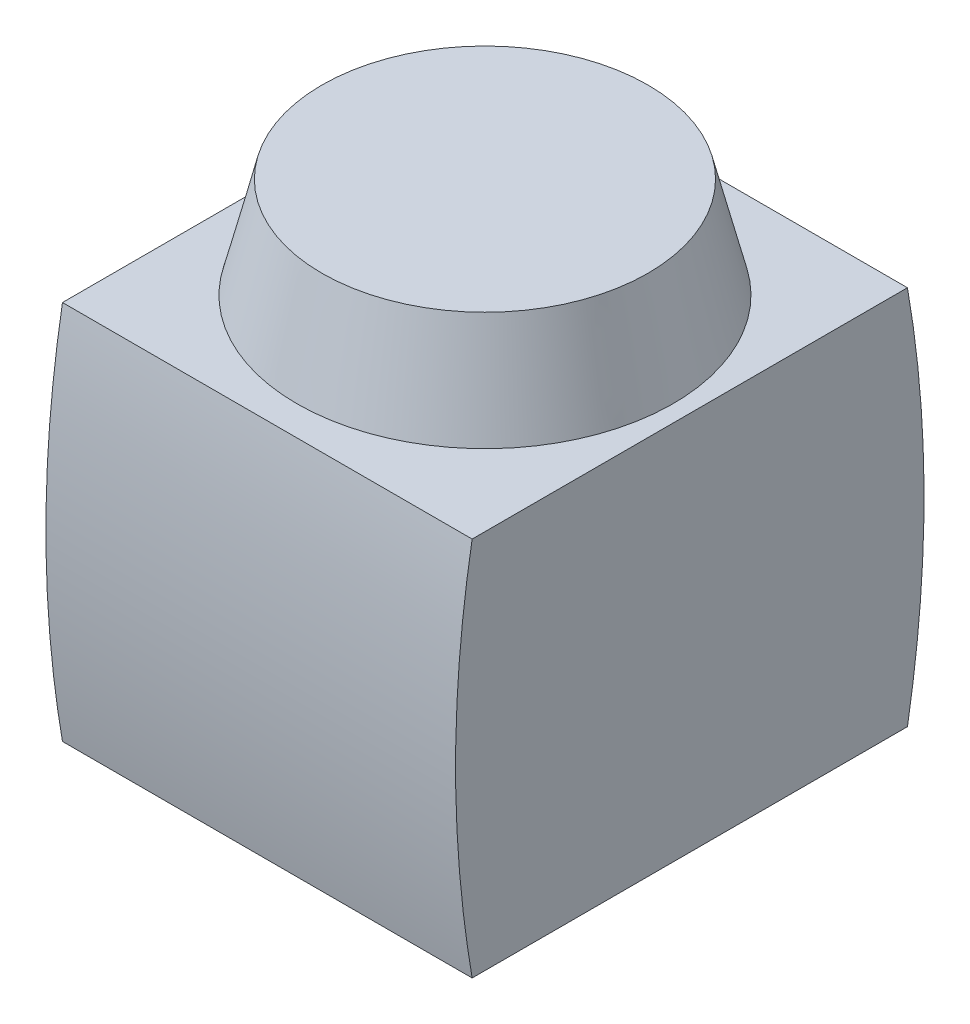
ISO-10303-21;
HEADER;
FILE_DESCRIPTION(('STEP AP214'),'2;1');
FILE_NAME('part.step','',(''),(''),'','','');
FILE_SCHEMA(('AUTOMOTIVE_DESIGN { 1 0 10303 214 1 1 1 1 }'));
ENDSEC;
DATA;
#1=APPLICATION_CONTEXT('core data for automotive mechanical design processes');
#2=APPLICATION_PROTOCOL_DEFINITION('international standard','automotive_design',2000,#1);
#3=PRODUCT_CONTEXT('',#1,'mechanical');
#4=PRODUCT('Part','Part','',(#3));
#5=PRODUCT_RELATED_PRODUCT_CATEGORY('part','',(#4));
#6=PRODUCT_DEFINITION_FORMATION('','',#4);
#7=PRODUCT_DEFINITION_CONTEXT('part definition',#1,'design');
#8=PRODUCT_DEFINITION('design','',#6,#7);
#9=PRODUCT_DEFINITION_SHAPE('','',#8);
#10=(LENGTH_UNIT() NAMED_UNIT(*) SI_UNIT(.MILLI.,.METRE.));
#11=(NAMED_UNIT(*) PLANE_ANGLE_UNIT() SI_UNIT($,.RADIAN.));
#12=(NAMED_UNIT(*) SI_UNIT($,.STERADIAN.) SOLID_ANGLE_UNIT());
#13=UNCERTAINTY_MEASURE_WITH_UNIT(LENGTH_MEASURE(1.E-05),#10,'distance_accuracy_value','');
#14=(GEOMETRIC_REPRESENTATION_CONTEXT(3) GLOBAL_UNCERTAINTY_ASSIGNED_CONTEXT((#13)) GLOBAL_UNIT_ASSIGNED_CONTEXT((#10,
#11,#12)) REPRESENTATION_CONTEXT('',''));
#15=CARTESIAN_POINT('',(0.,0.,0.));
#16=DIRECTION('',(0.,0.,1.));
#17=DIRECTION('',(1.,0.,0.));
#18=AXIS2_PLACEMENT_3D('',#15,#16,#17);
#19=CARTESIAN_POINT('',(-1.04,0.965000000000001,-1.105));
#20=DIRECTION('',(0.,1.,0.));
#21=DIRECTION('',(0.,0.,1.));
#22=AXIS2_PLACEMENT_3D('',#19,#20,#21);
#23=PLANE('',#22);
#24=DIRECTION('',(1.,0.,0.));
#25=VECTOR('',#24,1.);
#26=CARTESIAN_POINT('',(-1.04,0.965000000000001,1.105));
#27=LINE('',#26,#25);
#28=CARTESIAN_POINT('',(-1.04,0.965000000000001,1.105));
#29=VERTEX_POINT('',#28);
#30=CARTESIAN_POINT('',(1.04,0.965000000000001,1.105));
#31=VERTEX_POINT('',#30);
#32=EDGE_CURVE('E11',#29,#31,#27,.T.);
#33=ORIENTED_EDGE('',*,*,#32,.T.);
#34=DIRECTION('',(0.,0.,1.));
#35=VECTOR('',#34,1.);
#36=CARTESIAN_POINT('',(1.04,0.965000000000001,-1.105));
#37=LINE('',#36,#35);
#38=CARTESIAN_POINT('',(1.04,0.965000000000001,-1.105));
#39=VERTEX_POINT('',#38);
#40=EDGE_CURVE('E93',#39,#31,#37,.T.);
#41=ORIENTED_EDGE('',*,*,#40,.F.);
#42=DIRECTION('',(1.,0.,0.));
#43=VECTOR('',#42,1.);
#44=CARTESIAN_POINT('',(-1.04,0.965000000000001,-1.105));
#45=LINE('',#44,#43);
#46=CARTESIAN_POINT('',(-1.04,0.965000000000001,-1.105));
#47=VERTEX_POINT('',#46);
#48=EDGE_CURVE('E44',#47,#39,#45,.T.);
#49=ORIENTED_EDGE('',*,*,#48,.F.);
#50=DIRECTION('',(0.,0.,1.));
#51=VECTOR('',#50,1.);
#52=CARTESIAN_POINT('',(-1.04,0.965000000000001,-1.105));
#53=LINE('',#52,#51);
#54=EDGE_CURVE('E82',#47,#29,#53,.T.);
#55=ORIENTED_EDGE('',*,*,#54,.T.);
#56=EDGE_LOOP('',(#33,#41,#49,#55));
#57=FACE_BOUND('',#56,.T.);
#58=CARTESIAN_POINT('',(0.,0.965000000000001,0.));
#59=DIRECTION('',(0.,1.,0.));
#60=DIRECTION('',(0.,0.,1.));
#61=AXIS2_PLACEMENT_3D('',#58,#59,#60);
#62=CIRCLE('',#61,0.955);
#63=CARTESIAN_POINT('',(0.,0.965000000000001,0.955));
#64=VERTEX_POINT('',#63);
#65=EDGE_CURVE('E97',#64,#64,#62,.T.);
#66=ORIENTED_EDGE('',*,*,#65,.F.);
#67=EDGE_LOOP('',(#66));
#68=FACE_BOUND('',#67,.T.);
#69=ADVANCED_FACE('F34',(#57,#68),#23,.T.);
#70=CARTESIAN_POINT('',(-1.04,0.965000000000001,1.105));
#71=CARTESIAN_POINT('',(-1.04,0.0094099031604836,1.2733336612069));
#72=CARTESIAN_POINT('',(-1.04,-0.965000000000001,1.105));
#73=B_SPLINE_CURVE_WITH_KNOTS('',2,(#70,#71,#72),.UNSPECIFIED.,.F.,.F.,(3,3),(0.,1.),.UNSPECIFIED.);
#74=DIRECTION('',(1.,0.,0.));
#75=VECTOR('',#74,1.);
#76=SURFACE_OF_LINEAR_EXTRUSION('',#73,#75);
#77=DIRECTION('',(1.,0.,0.));
#78=VECTOR('',#77,1.);
#79=CARTESIAN_POINT('',(-1.04,-0.965000000000001,1.105));
#80=LINE('',#79,#78);
#81=CARTESIAN_POINT('',(-1.04,-0.965000000000001,1.105));
#82=VERTEX_POINT('',#81);
#83=CARTESIAN_POINT('',(1.04,-0.965000000000001,1.105));
#84=VERTEX_POINT('',#83);
#85=EDGE_CURVE('E39',#82,#84,#80,.T.);
#86=ORIENTED_EDGE('',*,*,#85,.T.);
#87=CARTESIAN_POINT('',(1.04,0.965000000000001,1.105));
#88=CARTESIAN_POINT('',(1.04,0.0094099031604836,1.2733336612069));
#89=CARTESIAN_POINT('',(1.04,-0.965000000000001,1.105));
#90=B_SPLINE_CURVE_WITH_KNOTS('',2,(#87,#88,#89),.UNSPECIFIED.,.F.,.F.,(3,3),(0.,1.),.UNSPECIFIED.);
#91=EDGE_CURVE('E76',#31,#84,#90,.T.);
#92=ORIENTED_EDGE('',*,*,#91,.F.);
#93=ORIENTED_EDGE('',*,*,#32,.F.);
#94=EDGE_CURVE('E77',#29,#82,#73,.T.);
#95=ORIENTED_EDGE('',*,*,#94,.T.);
#96=EDGE_LOOP('',(#86,#92,#93,#95));
#97=FACE_BOUND('',#96,.T.);
#98=ADVANCED_FACE('F36',(#97),#76,.T.);
#99=CARTESIAN_POINT('',(-1.04,-0.965000000000001,-1.105));
#100=CARTESIAN_POINT('',(-1.04,0.00940990316048227,-1.27333366120689));
#101=CARTESIAN_POINT('',(-1.04,0.965000000000001,-1.105));
#102=B_SPLINE_CURVE_WITH_KNOTS('',2,(#99,#100,#101),.UNSPECIFIED.,.F.,.F.,(3,3),(0.,1.),.UNSPECIFIED.);
#103=DIRECTION('',(1.,0.,0.));
#104=VECTOR('',#103,1.);
#105=SURFACE_OF_LINEAR_EXTRUSION('',#102,#104);
#106=ORIENTED_EDGE('',*,*,#48,.T.);
#107=CARTESIAN_POINT('',(1.04,-0.965000000000001,-1.105));
#108=CARTESIAN_POINT('',(1.04,0.00940990316048227,-1.27333366120689));
#109=CARTESIAN_POINT('',(1.04,0.965000000000001,-1.105));
#110=B_SPLINE_CURVE_WITH_KNOTS('',2,(#107,#108,#109),.UNSPECIFIED.,.F.,.F.,(3,3),(0.,1.),.UNSPECIFIED.);
#111=CARTESIAN_POINT('',(1.04,-0.965000000000001,-1.105));
#112=VERTEX_POINT('',#111);
#113=EDGE_CURVE('E89',#112,#39,#110,.T.);
#114=ORIENTED_EDGE('',*,*,#113,.F.);
#115=DIRECTION('',(1.,0.,0.));
#116=VECTOR('',#115,1.);
#117=CARTESIAN_POINT('',(-1.04,-0.965000000000001,-1.105));
#118=LINE('',#117,#116);
#119=CARTESIAN_POINT('',(-1.04,-0.965000000000001,-1.105));
#120=VERTEX_POINT('',#119);
#121=EDGE_CURVE('E81',#120,#112,#118,.T.);
#122=ORIENTED_EDGE('',*,*,#121,.F.);
#123=EDGE_CURVE('E121',#120,#47,#102,.T.);
#124=ORIENTED_EDGE('',*,*,#123,.T.);
#125=EDGE_LOOP('',(#106,#114,#122,#124));
#126=FACE_BOUND('',#125,.T.);
#127=ADVANCED_FACE('F130',(#126),#105,.T.);
#128=CARTESIAN_POINT('',(-1.04,-0.965000000000001,1.105));
#129=DIRECTION('',(0.,-1.,0.));
#130=DIRECTION('',(0.,0.,-1.));
#131=AXIS2_PLACEMENT_3D('',#128,#129,#130);
#132=PLANE('',#131);
#133=ORIENTED_EDGE('',*,*,#121,.T.);
#134=DIRECTION('',(0.,0.,-1.));
#135=VECTOR('',#134,1.);
#136=CARTESIAN_POINT('',(1.04,-0.965000000000001,1.105));
#137=LINE('',#136,#135);
#138=EDGE_CURVE('E84',#84,#112,#137,.T.);
#139=ORIENTED_EDGE('',*,*,#138,.F.);
#140=ORIENTED_EDGE('',*,*,#85,.F.);
#141=DIRECTION('',(0.,0.,-1.));
#142=VECTOR('',#141,1.);
#143=CARTESIAN_POINT('',(-1.04,-0.965000000000001,1.105));
#144=LINE('',#143,#142);
#145=EDGE_CURVE('E116',#82,#120,#144,.T.);
#146=ORIENTED_EDGE('',*,*,#145,.T.);
#147=EDGE_LOOP('',(#133,#139,#140,#146));
#148=FACE_BOUND('',#147,.T.);
#149=ADVANCED_FACE('F85',(#148),#132,.T.);
#150=CARTESIAN_POINT('',(-1.04,0.00470495158024176,1.18916683060345));
#151=DIRECTION('',(-1.,0.,0.));
#152=DIRECTION('',(0.,0.,1.));
#153=AXIS2_PLACEMENT_3D('',#150,#151,#152);
#154=PLANE('',#153);
#155=ORIENTED_EDGE('',*,*,#94,.F.);
#156=ORIENTED_EDGE('',*,*,#54,.F.);
#157=ORIENTED_EDGE('',*,*,#123,.F.);
#158=ORIENTED_EDGE('',*,*,#145,.F.);
#159=EDGE_LOOP('',(#155,#156,#157,#158));
#160=FACE_BOUND('',#159,.T.);
#161=ADVANCED_FACE('F136',(#160),#154,.T.);
#162=CARTESIAN_POINT('',(1.04,0.00470495158024176,1.18916683060345));
#163=DIRECTION('',(-1.,0.,0.));
#164=DIRECTION('',(0.,0.,1.));
#165=AXIS2_PLACEMENT_3D('',#162,#163,#164);
#166=PLANE('',#165);
#167=ORIENTED_EDGE('',*,*,#91,.T.);
#168=ORIENTED_EDGE('',*,*,#138,.T.);
#169=ORIENTED_EDGE('',*,*,#113,.T.);
#170=ORIENTED_EDGE('',*,*,#40,.T.);
#171=EDGE_LOOP('',(#167,#168,#169,#170));
#172=FACE_BOUND('',#171,.T.);
#173=ADVANCED_FACE('F92',(#172),#166,.F.);
#174=CARTESIAN_POINT('',(0.,0.965000000000001,0.));
#175=DIRECTION('',(0.,-1.,0.));
#176=DIRECTION('',(0.,0.,1.));
#177=AXIS2_PLACEMENT_3D('',#174,#175,#176);
#178=CONICAL_SURFACE('',#177,0.955,0.244346095279207);
#179=CARTESIAN_POINT('',(0.,1.475,0.));
#180=DIRECTION('',(0.,1.,0.));
#181=DIRECTION('',(0.,0.,1.));
#182=AXIS2_PLACEMENT_3D('',#179,#180,#181);
#183=CIRCLE('',#182,0.827842718549977);
#184=CARTESIAN_POINT('',(0.,1.475,0.827842718549978));
#185=VERTEX_POINT('',#184);
#186=EDGE_CURVE('E94',#185,#185,#183,.T.);
#187=ORIENTED_EDGE('',*,*,#186,.F.);
#188=EDGE_LOOP('',(#187));
#189=FACE_BOUND('',#188,.T.);
#190=ORIENTED_EDGE('',*,*,#65,.T.);
#191=EDGE_LOOP('',(#190));
#192=FACE_BOUND('',#191,.T.);
#193=ADVANCED_FACE('F149',(#189,#192),#178,.T.);
#194=CARTESIAN_POINT('',(0.,1.475,0.));
#195=DIRECTION('',(0.,1.,0.));
#196=DIRECTION('',(0.,0.,1.));
#197=AXIS2_PLACEMENT_3D('',#194,#195,#196);
#198=PLANE('',#197);
#199=ORIENTED_EDGE('',*,*,#186,.T.);
#200=EDGE_LOOP('',(#199));
#201=FACE_BOUND('',#200,.T.);
#202=ADVANCED_FACE('F151',(#201),#198,.T.);
#203=CLOSED_SHELL('',(#69,#98,#127,#149,#161,#173,#193,#202));
#204=MANIFOLD_SOLID_BREP('B2',#203);
#205=ADVANCED_BREP_SHAPE_REPRESENTATION('',(#18,#204),#14);
#206=SHAPE_DEFINITION_REPRESENTATION(#9,#205);
ENDSEC;
END-ISO-10303-21;
